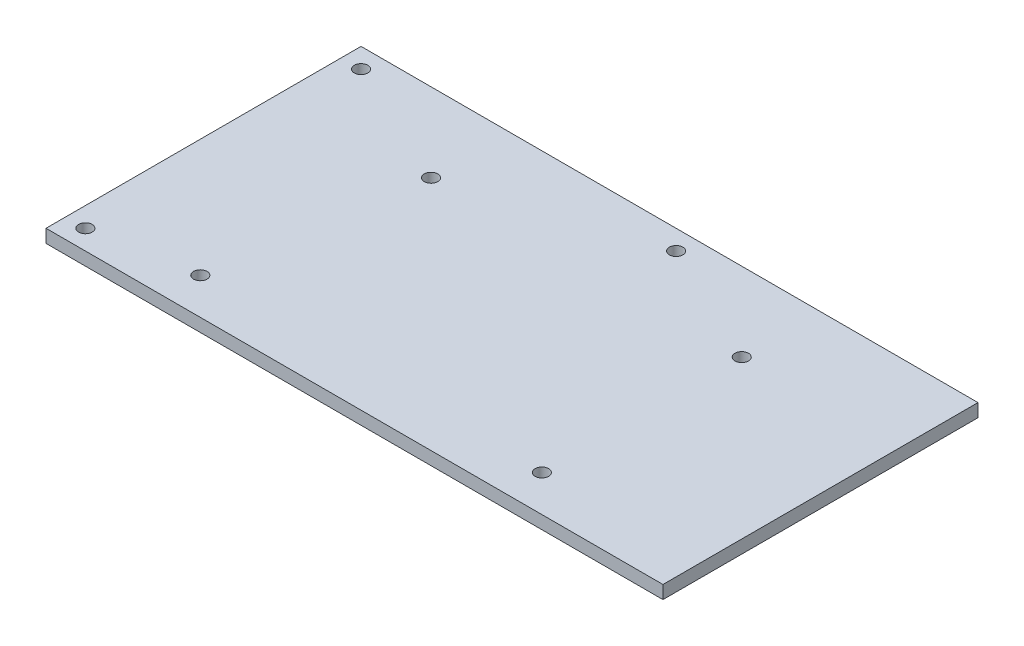
ISO-10303-21;
HEADER;
FILE_DESCRIPTION(('STEP AP214'),'2;1');
FILE_NAME('part.step','',(''),(''),'','','');
FILE_SCHEMA(('AUTOMOTIVE_DESIGN { 1 0 10303 214 1 1 1 1 }'));
ENDSEC;
DATA;
#1=APPLICATION_CONTEXT('core data for automotive mechanical design processes');
#2=APPLICATION_PROTOCOL_DEFINITION('international standard','automotive_design',2000,#1);
#3=PRODUCT_CONTEXT('',#1,'mechanical');
#4=PRODUCT('Part','Part','',(#3));
#5=PRODUCT_RELATED_PRODUCT_CATEGORY('part','',(#4));
#6=PRODUCT_DEFINITION_FORMATION('','',#4);
#7=PRODUCT_DEFINITION_CONTEXT('part definition',#1,'design');
#8=PRODUCT_DEFINITION('design','',#6,#7);
#9=PRODUCT_DEFINITION_SHAPE('','',#8);
#10=(LENGTH_UNIT() NAMED_UNIT(*) SI_UNIT(.MILLI.,.METRE.));
#11=(NAMED_UNIT(*) PLANE_ANGLE_UNIT() SI_UNIT($,.RADIAN.));
#12=(NAMED_UNIT(*) SI_UNIT($,.STERADIAN.) SOLID_ANGLE_UNIT());
#13=UNCERTAINTY_MEASURE_WITH_UNIT(LENGTH_MEASURE(1.E-05),#10,'distance_accuracy_value','');
#14=(GEOMETRIC_REPRESENTATION_CONTEXT(3) GLOBAL_UNCERTAINTY_ASSIGNED_CONTEXT((#13)) GLOBAL_UNIT_ASSIGNED_CONTEXT((#10,
#11,#12)) REPRESENTATION_CONTEXT('',''));
#15=CARTESIAN_POINT('',(0.,0.,0.));
#16=DIRECTION('',(0.,0.,1.));
#17=DIRECTION('',(1.,0.,0.));
#18=AXIS2_PLACEMENT_3D('',#15,#16,#17);
#19=CARTESIAN_POINT('',(74.6125,3.175,38.1));
#20=DIRECTION('',(-1.,0.,0.));
#21=DIRECTION('',(0.,0.,1.));
#22=AXIS2_PLACEMENT_3D('',#19,#20,#21);
#23=PLANE('',#22);
#24=DIRECTION('',(0.,0.,-1.));
#25=VECTOR('',#24,1.);
#26=CARTESIAN_POINT('',(74.6125,0.,38.1));
#27=LINE('',#26,#25);
#28=CARTESIAN_POINT('',(74.6125,0.,38.1));
#29=VERTEX_POINT('',#28);
#30=CARTESIAN_POINT('',(74.6125,0.,-38.1));
#31=VERTEX_POINT('',#30);
#32=EDGE_CURVE('E98',#29,#31,#27,.T.);
#33=ORIENTED_EDGE('',*,*,#32,.T.);
#34=DIRECTION('',(0.,-1.,0.));
#35=VECTOR('',#34,1.);
#36=CARTESIAN_POINT('',(74.6125,3.175,-38.1));
#37=LINE('',#36,#35);
#38=CARTESIAN_POINT('',(74.6125,3.175,-38.1));
#39=VERTEX_POINT('',#38);
#40=EDGE_CURVE('E11',#39,#31,#37,.T.);
#41=ORIENTED_EDGE('',*,*,#40,.F.);
#42=DIRECTION('',(0.,0.,-1.));
#43=VECTOR('',#42,1.);
#44=CARTESIAN_POINT('',(74.6125,3.175,38.1));
#45=LINE('',#44,#43);
#46=CARTESIAN_POINT('',(74.6125,3.175,38.1));
#47=VERTEX_POINT('',#46);
#48=EDGE_CURVE('E86',#47,#39,#45,.T.);
#49=ORIENTED_EDGE('',*,*,#48,.F.);
#50=DIRECTION('',(0.,-1.,0.));
#51=VECTOR('',#50,1.);
#52=CARTESIAN_POINT('',(74.6125,3.175,38.1));
#53=LINE('',#52,#51);
#54=EDGE_CURVE('E94',#47,#29,#53,.T.);
#55=ORIENTED_EDGE('',*,*,#54,.T.);
#56=EDGE_LOOP('',(#33,#41,#49,#55));
#57=FACE_BOUND('',#56,.T.);
#58=ADVANCED_FACE('F35',(#57),#23,.F.);
#59=CARTESIAN_POINT('',(-74.6125,3.175,-38.1));
#60=DIRECTION('',(0.,0.,1.));
#61=DIRECTION('',(1.,0.,0.));
#62=AXIS2_PLACEMENT_3D('',#59,#60,#61);
#63=PLANE('',#62);
#64=DIRECTION('',(-1.,0.,0.));
#65=VECTOR('',#64,1.);
#66=CARTESIAN_POINT('',(-74.6125,0.,-38.1));
#67=LINE('',#66,#65);
#68=CARTESIAN_POINT('',(-74.6125,0.,-38.1));
#69=VERTEX_POINT('',#68);
#70=EDGE_CURVE('E90',#31,#69,#67,.T.);
#71=ORIENTED_EDGE('',*,*,#70,.T.);
#72=DIRECTION('',(0.,-1.,0.));
#73=VECTOR('',#72,1.);
#74=CARTESIAN_POINT('',(-74.6125,3.175,-38.1));
#75=LINE('',#74,#73);
#76=CARTESIAN_POINT('',(-74.6125,3.175,-38.1));
#77=VERTEX_POINT('',#76);
#78=EDGE_CURVE('E43',#77,#69,#75,.T.);
#79=ORIENTED_EDGE('',*,*,#78,.F.);
#80=DIRECTION('',(-1.,0.,0.));
#81=VECTOR('',#80,1.);
#82=CARTESIAN_POINT('',(-74.6125,3.175,-38.1));
#83=LINE('',#82,#81);
#84=EDGE_CURVE('E81',#39,#77,#83,.T.);
#85=ORIENTED_EDGE('',*,*,#84,.F.);
#86=ORIENTED_EDGE('',*,*,#40,.T.);
#87=EDGE_LOOP('',(#71,#79,#85,#86));
#88=FACE_BOUND('',#87,.T.);
#89=ADVANCED_FACE('F89',(#88),#63,.F.);
#90=CARTESIAN_POINT('',(-74.6125,3.175,38.1));
#91=DIRECTION('',(1.,0.,0.));
#92=DIRECTION('',(0.,0.,-1.));
#93=AXIS2_PLACEMENT_3D('',#90,#91,#92);
#94=PLANE('',#93);
#95=DIRECTION('',(0.,0.,1.));
#96=VECTOR('',#95,1.);
#97=CARTESIAN_POINT('',(-74.6125,0.,38.1));
#98=LINE('',#97,#96);
#99=CARTESIAN_POINT('',(-74.6125,0.,38.1));
#100=VERTEX_POINT('',#99);
#101=EDGE_CURVE('E68',#69,#100,#98,.T.);
#102=ORIENTED_EDGE('',*,*,#101,.T.);
#103=DIRECTION('',(0.,-1.,0.));
#104=VECTOR('',#103,1.);
#105=CARTESIAN_POINT('',(-74.6125,3.175,38.1));
#106=LINE('',#105,#104);
#107=CARTESIAN_POINT('',(-74.6125,3.175,38.1));
#108=VERTEX_POINT('',#107);
#109=EDGE_CURVE('E91',#108,#100,#106,.T.);
#110=ORIENTED_EDGE('',*,*,#109,.F.);
#111=DIRECTION('',(0.,0.,1.));
#112=VECTOR('',#111,1.);
#113=CARTESIAN_POINT('',(-74.6125,3.175,38.1));
#114=LINE('',#113,#112);
#115=EDGE_CURVE('E84',#77,#108,#114,.T.);
#116=ORIENTED_EDGE('',*,*,#115,.F.);
#117=ORIENTED_EDGE('',*,*,#78,.T.);
#118=EDGE_LOOP('',(#102,#110,#116,#117));
#119=FACE_BOUND('',#118,.T.);
#120=ADVANCED_FACE('F92',(#119),#94,.F.);
#121=CARTESIAN_POINT('',(-74.6125,3.175,38.1));
#122=DIRECTION('',(0.,0.,-1.));
#123=DIRECTION('',(-1.,0.,0.));
#124=AXIS2_PLACEMENT_3D('',#121,#122,#123);
#125=PLANE('',#124);
#126=DIRECTION('',(1.,0.,0.));
#127=VECTOR('',#126,1.);
#128=CARTESIAN_POINT('',(-74.6125,0.,38.1));
#129=LINE('',#128,#127);
#130=EDGE_CURVE('E74',#100,#29,#129,.T.);
#131=ORIENTED_EDGE('',*,*,#130,.T.);
#132=ORIENTED_EDGE('',*,*,#54,.F.);
#133=DIRECTION('',(1.,0.,0.));
#134=VECTOR('',#133,1.);
#135=CARTESIAN_POINT('',(-74.6125,3.175,38.1));
#136=LINE('',#135,#134);
#137=EDGE_CURVE('E51',#108,#47,#136,.T.);
#138=ORIENTED_EDGE('',*,*,#137,.F.);
#139=ORIENTED_EDGE('',*,*,#109,.T.);
#140=EDGE_LOOP('',(#131,#132,#138,#139));
#141=FACE_BOUND('',#140,.T.);
#142=ADVANCED_FACE('F106',(#141),#125,.F.);
#143=CARTESIAN_POINT('',(0.,3.175,0.));
#144=DIRECTION('',(0.,-1.,0.));
#145=DIRECTION('',(0.,0.,-1.));
#146=AXIS2_PLACEMENT_3D('',#143,#144,#145);
#147=PLANE('',#146);
#148=CARTESIAN_POINT('',(36.5125,3.175,-19.05));
#149=DIRECTION('',(0.,1.,0.));
#150=DIRECTION('',(0.,0.,1.));
#151=AXIS2_PLACEMENT_3D('',#148,#149,#150);
#152=CIRCLE('',#151,1.63195);
#153=CARTESIAN_POINT('',(36.5125,3.175,-17.41805));
#154=VERTEX_POINT('',#153);
#155=EDGE_CURVE('E145',#154,#154,#152,.T.);
#156=ORIENTED_EDGE('',*,*,#155,.F.);
#157=EDGE_LOOP('',(#156));
#158=FACE_BOUND('',#157,.T.);
#159=CARTESIAN_POINT('',(36.5125,3.175,29.2862));
#160=DIRECTION('',(0.,1.,0.));
#161=DIRECTION('',(0.,0.,1.));
#162=AXIS2_PLACEMENT_3D('',#159,#160,#161);
#163=CIRCLE('',#162,1.63195);
#164=CARTESIAN_POINT('',(36.5125,3.175,30.91815));
#165=VERTEX_POINT('',#164);
#166=EDGE_CURVE('E139',#165,#165,#163,.T.);
#167=ORIENTED_EDGE('',*,*,#166,.F.);
#168=EDGE_LOOP('',(#167));
#169=FACE_BOUND('',#168,.T.);
#170=CARTESIAN_POINT('',(-46.1137000000001,3.175,29.2862));
#171=DIRECTION('',(0.,1.,0.));
#172=DIRECTION('',(0.,0.,1.));
#173=AXIS2_PLACEMENT_3D('',#170,#171,#172);
#174=CIRCLE('',#173,1.63195);
#175=CARTESIAN_POINT('',(-46.1137000000001,3.175,30.91815));
#176=VERTEX_POINT('',#175);
#177=EDGE_CURVE('E133',#176,#176,#174,.T.);
#178=ORIENTED_EDGE('',*,*,#177,.F.);
#179=EDGE_LOOP('',(#178));
#180=FACE_BOUND('',#179,.T.);
#181=CARTESIAN_POINT('',(-38.6207,3.175,-19.05));
#182=DIRECTION('',(0.,1.,0.));
#183=DIRECTION('',(0.,0.,1.));
#184=AXIS2_PLACEMENT_3D('',#181,#182,#183);
#185=CIRCLE('',#184,1.63195);
#186=CARTESIAN_POINT('',(-38.6207,3.175,-17.41805));
#187=VERTEX_POINT('',#186);
#188=EDGE_CURVE('E127',#187,#187,#185,.T.);
#189=ORIENTED_EDGE('',*,*,#188,.F.);
#190=EDGE_LOOP('',(#189));
#191=FACE_BOUND('',#190,.T.);
#192=CARTESIAN_POINT('',(-69.85,3.175,33.3375));
#193=DIRECTION('',(0.,1.,0.));
#194=DIRECTION('',(0.,0.,1.));
#195=AXIS2_PLACEMENT_3D('',#192,#193,#194);
#196=CIRCLE('',#195,1.63194999999999);
#197=CARTESIAN_POINT('',(-69.85,3.175,34.96945));
#198=VERTEX_POINT('',#197);
#199=EDGE_CURVE('E121',#198,#198,#196,.T.);
#200=ORIENTED_EDGE('',*,*,#199,.F.);
#201=EDGE_LOOP('',(#200));
#202=FACE_BOUND('',#201,.T.);
#203=CARTESIAN_POINT('',(6.34999999999995,3.175,-33.3375));
#204=DIRECTION('',(0.,1.,0.));
#205=DIRECTION('',(0.,0.,1.));
#206=AXIS2_PLACEMENT_3D('',#203,#204,#205);
#207=CIRCLE('',#206,1.63195);
#208=CARTESIAN_POINT('',(6.34999999999995,3.175,-31.70555));
#209=VERTEX_POINT('',#208);
#210=EDGE_CURVE('E115',#209,#209,#207,.T.);
#211=ORIENTED_EDGE('',*,*,#210,.F.);
#212=EDGE_LOOP('',(#211));
#213=FACE_BOUND('',#212,.T.);
#214=CARTESIAN_POINT('',(-69.85,3.175,-33.3375));
#215=DIRECTION('',(0.,1.,0.));
#216=DIRECTION('',(0.,0.,1.));
#217=AXIS2_PLACEMENT_3D('',#214,#215,#216);
#218=CIRCLE('',#217,1.63194999999999);
#219=CARTESIAN_POINT('',(-69.85,3.175,-31.70555));
#220=VERTEX_POINT('',#219);
#221=EDGE_CURVE('E101',#220,#220,#218,.T.);
#222=ORIENTED_EDGE('',*,*,#221,.F.);
#223=EDGE_LOOP('',(#222));
#224=FACE_BOUND('',#223,.T.);
#225=ORIENTED_EDGE('',*,*,#48,.T.);
#226=ORIENTED_EDGE('',*,*,#84,.T.);
#227=ORIENTED_EDGE('',*,*,#115,.T.);
#228=ORIENTED_EDGE('',*,*,#137,.T.);
#229=EDGE_LOOP('',(#225,#226,#227,#228));
#230=FACE_BOUND('',#229,.T.);
#231=ADVANCED_FACE('F82',(#158,#169,#180,#191,#202,#213,#224,#230),#147,.F.);
#232=CARTESIAN_POINT('',(0.,0.,0.));
#233=DIRECTION('',(0.,-1.,0.));
#234=DIRECTION('',(0.,0.,-1.));
#235=AXIS2_PLACEMENT_3D('',#232,#233,#234);
#236=PLANE('',#235);
#237=CARTESIAN_POINT('',(36.5125,0.,-19.05));
#238=DIRECTION('',(0.,-1.,0.));
#239=DIRECTION('',(0.,0.,-1.));
#240=AXIS2_PLACEMENT_3D('',#237,#238,#239);
#241=CIRCLE('',#240,1.63195);
#242=CARTESIAN_POINT('',(36.5125,0.,-20.68195));
#243=VERTEX_POINT('',#242);
#244=EDGE_CURVE('E148',#243,#243,#241,.F.);
#245=ORIENTED_EDGE('',*,*,#244,.T.);
#246=EDGE_LOOP('',(#245));
#247=FACE_BOUND('',#246,.T.);
#248=CARTESIAN_POINT('',(36.5125,0.,29.2862));
#249=DIRECTION('',(0.,-1.,0.));
#250=DIRECTION('',(0.,0.,-1.));
#251=AXIS2_PLACEMENT_3D('',#248,#249,#250);
#252=CIRCLE('',#251,1.63195);
#253=CARTESIAN_POINT('',(36.5125,0.,27.65425));
#254=VERTEX_POINT('',#253);
#255=EDGE_CURVE('E142',#254,#254,#252,.F.);
#256=ORIENTED_EDGE('',*,*,#255,.T.);
#257=EDGE_LOOP('',(#256));
#258=FACE_BOUND('',#257,.T.);
#259=CARTESIAN_POINT('',(-46.1137000000001,0.,29.2862));
#260=DIRECTION('',(0.,-1.,0.));
#261=DIRECTION('',(0.,0.,-1.));
#262=AXIS2_PLACEMENT_3D('',#259,#260,#261);
#263=CIRCLE('',#262,1.63195);
#264=CARTESIAN_POINT('',(-46.1137000000001,0.,27.65425));
#265=VERTEX_POINT('',#264);
#266=EDGE_CURVE('E136',#265,#265,#263,.F.);
#267=ORIENTED_EDGE('',*,*,#266,.T.);
#268=EDGE_LOOP('',(#267));
#269=FACE_BOUND('',#268,.T.);
#270=CARTESIAN_POINT('',(-38.6207,0.,-19.05));
#271=DIRECTION('',(0.,-1.,0.));
#272=DIRECTION('',(0.,0.,-1.));
#273=AXIS2_PLACEMENT_3D('',#270,#271,#272);
#274=CIRCLE('',#273,1.63195);
#275=CARTESIAN_POINT('',(-38.6207,0.,-20.68195));
#276=VERTEX_POINT('',#275);
#277=EDGE_CURVE('E130',#276,#276,#274,.F.);
#278=ORIENTED_EDGE('',*,*,#277,.T.);
#279=EDGE_LOOP('',(#278));
#280=FACE_BOUND('',#279,.T.);
#281=CARTESIAN_POINT('',(-69.85,0.,33.3375));
#282=DIRECTION('',(0.,-1.,0.));
#283=DIRECTION('',(0.,0.,-1.));
#284=AXIS2_PLACEMENT_3D('',#281,#282,#283);
#285=CIRCLE('',#284,1.63194999999999);
#286=CARTESIAN_POINT('',(-69.85,0.,31.70555));
#287=VERTEX_POINT('',#286);
#288=EDGE_CURVE('E124',#287,#287,#285,.F.);
#289=ORIENTED_EDGE('',*,*,#288,.T.);
#290=EDGE_LOOP('',(#289));
#291=FACE_BOUND('',#290,.T.);
#292=CARTESIAN_POINT('',(6.34999999999995,0.,-33.3375));
#293=DIRECTION('',(0.,-1.,0.));
#294=DIRECTION('',(0.,0.,-1.));
#295=AXIS2_PLACEMENT_3D('',#292,#293,#294);
#296=CIRCLE('',#295,1.63195);
#297=CARTESIAN_POINT('',(6.34999999999995,0.,-34.96945));
#298=VERTEX_POINT('',#297);
#299=EDGE_CURVE('E118',#298,#298,#296,.F.);
#300=ORIENTED_EDGE('',*,*,#299,.T.);
#301=EDGE_LOOP('',(#300));
#302=FACE_BOUND('',#301,.T.);
#303=CARTESIAN_POINT('',(-69.85,0.,-33.3375));
#304=DIRECTION('',(0.,-1.,0.));
#305=DIRECTION('',(0.,0.,-1.));
#306=AXIS2_PLACEMENT_3D('',#303,#304,#305);
#307=CIRCLE('',#306,1.63194999999999);
#308=CARTESIAN_POINT('',(-69.85,0.,-34.96945));
#309=VERTEX_POINT('',#308);
#310=EDGE_CURVE('E112',#309,#309,#307,.F.);
#311=ORIENTED_EDGE('',*,*,#310,.T.);
#312=EDGE_LOOP('',(#311));
#313=FACE_BOUND('',#312,.T.);
#314=ORIENTED_EDGE('',*,*,#32,.F.);
#315=ORIENTED_EDGE('',*,*,#130,.F.);
#316=ORIENTED_EDGE('',*,*,#101,.F.);
#317=ORIENTED_EDGE('',*,*,#70,.F.);
#318=EDGE_LOOP('',(#314,#315,#316,#317));
#319=FACE_BOUND('',#318,.T.);
#320=ADVANCED_FACE('F109',(#247,#258,#269,#280,#291,#302,#313,#319),#236,.T.);
#321=CARTESIAN_POINT('',(-69.85,-0.00100000000000013,-33.3375));
#322=DIRECTION('',(0.,1.,0.));
#323=DIRECTION('',(0.,0.,1.));
#324=AXIS2_PLACEMENT_3D('',#321,#322,#323);
#325=CYLINDRICAL_SURFACE('',#324,1.63194999999999);
#326=ORIENTED_EDGE('',*,*,#310,.F.);
#327=EDGE_LOOP('',(#326));
#328=FACE_BOUND('',#327,.T.);
#329=ORIENTED_EDGE('',*,*,#221,.T.);
#330=EDGE_LOOP('',(#329));
#331=FACE_BOUND('',#330,.T.);
#332=ADVANCED_FACE('F171',(#328,#331),#325,.F.);
#333=CARTESIAN_POINT('',(6.34999999999995,-0.00100000000000013,-33.3375));
#334=DIRECTION('',(0.,1.,0.));
#335=DIRECTION('',(0.,0.,1.));
#336=AXIS2_PLACEMENT_3D('',#333,#334,#335);
#337=CYLINDRICAL_SURFACE('',#336,1.63195);
#338=ORIENTED_EDGE('',*,*,#299,.F.);
#339=EDGE_LOOP('',(#338));
#340=FACE_BOUND('',#339,.T.);
#341=ORIENTED_EDGE('',*,*,#210,.T.);
#342=EDGE_LOOP('',(#341));
#343=FACE_BOUND('',#342,.T.);
#344=ADVANCED_FACE('F173',(#340,#343),#337,.F.);
#345=CARTESIAN_POINT('',(-69.85,-0.00100000000000013,33.3375));
#346=DIRECTION('',(0.,1.,0.));
#347=DIRECTION('',(0.,0.,1.));
#348=AXIS2_PLACEMENT_3D('',#345,#346,#347);
#349=CYLINDRICAL_SURFACE('',#348,1.63194999999999);
#350=ORIENTED_EDGE('',*,*,#288,.F.);
#351=EDGE_LOOP('',(#350));
#352=FACE_BOUND('',#351,.T.);
#353=ORIENTED_EDGE('',*,*,#199,.T.);
#354=EDGE_LOOP('',(#353));
#355=FACE_BOUND('',#354,.T.);
#356=ADVANCED_FACE('F180',(#352,#355),#349,.F.);
#357=CARTESIAN_POINT('',(-38.6207,-0.00100000000000013,-19.05));
#358=DIRECTION('',(0.,1.,0.));
#359=DIRECTION('',(0.,0.,1.));
#360=AXIS2_PLACEMENT_3D('',#357,#358,#359);
#361=CYLINDRICAL_SURFACE('',#360,1.63195);
#362=ORIENTED_EDGE('',*,*,#277,.F.);
#363=EDGE_LOOP('',(#362));
#364=FACE_BOUND('',#363,.T.);
#365=ORIENTED_EDGE('',*,*,#188,.T.);
#366=EDGE_LOOP('',(#365));
#367=FACE_BOUND('',#366,.T.);
#368=ADVANCED_FACE('F217',(#364,#367),#361,.F.);
#369=CARTESIAN_POINT('',(-46.1137000000001,-0.00100000000000013,29.2862));
#370=DIRECTION('',(0.,1.,0.));
#371=DIRECTION('',(0.,0.,1.));
#372=AXIS2_PLACEMENT_3D('',#369,#370,#371);
#373=CYLINDRICAL_SURFACE('',#372,1.63195);
#374=ORIENTED_EDGE('',*,*,#266,.F.);
#375=EDGE_LOOP('',(#374));
#376=FACE_BOUND('',#375,.T.);
#377=ORIENTED_EDGE('',*,*,#177,.T.);
#378=EDGE_LOOP('',(#377));
#379=FACE_BOUND('',#378,.T.);
#380=ADVANCED_FACE('F222',(#376,#379),#373,.F.);
#381=CARTESIAN_POINT('',(36.5125,-0.00100000000000013,29.2862));
#382=DIRECTION('',(0.,1.,0.));
#383=DIRECTION('',(0.,0.,1.));
#384=AXIS2_PLACEMENT_3D('',#381,#382,#383);
#385=CYLINDRICAL_SURFACE('',#384,1.63195);
#386=ORIENTED_EDGE('',*,*,#255,.F.);
#387=EDGE_LOOP('',(#386));
#388=FACE_BOUND('',#387,.T.);
#389=ORIENTED_EDGE('',*,*,#166,.T.);
#390=EDGE_LOOP('',(#389));
#391=FACE_BOUND('',#390,.T.);
#392=ADVANCED_FACE('F234',(#388,#391),#385,.F.);
#393=CARTESIAN_POINT('',(36.5125,-0.00100000000000013,-19.05));
#394=DIRECTION('',(0.,1.,0.));
#395=DIRECTION('',(0.,0.,1.));
#396=AXIS2_PLACEMENT_3D('',#393,#394,#395);
#397=CYLINDRICAL_SURFACE('',#396,1.63195);
#398=ORIENTED_EDGE('',*,*,#244,.F.);
#399=EDGE_LOOP('',(#398));
#400=FACE_BOUND('',#399,.T.);
#401=ORIENTED_EDGE('',*,*,#155,.T.);
#402=EDGE_LOOP('',(#401));
#403=FACE_BOUND('',#402,.T.);
#404=ADVANCED_FACE('F154',(#400,#403),#397,.F.);
#405=CLOSED_SHELL('',(#58,#89,#120,#142,#231,#320,#332,#344,#356,#368,#380,#392,#404));
#406=MANIFOLD_SOLID_BREP('B2',#405);
#407=ADVANCED_BREP_SHAPE_REPRESENTATION('',(#18,#406),#14);
#408=SHAPE_DEFINITION_REPRESENTATION(#9,#407);
ENDSEC;
END-ISO-10303-21;
